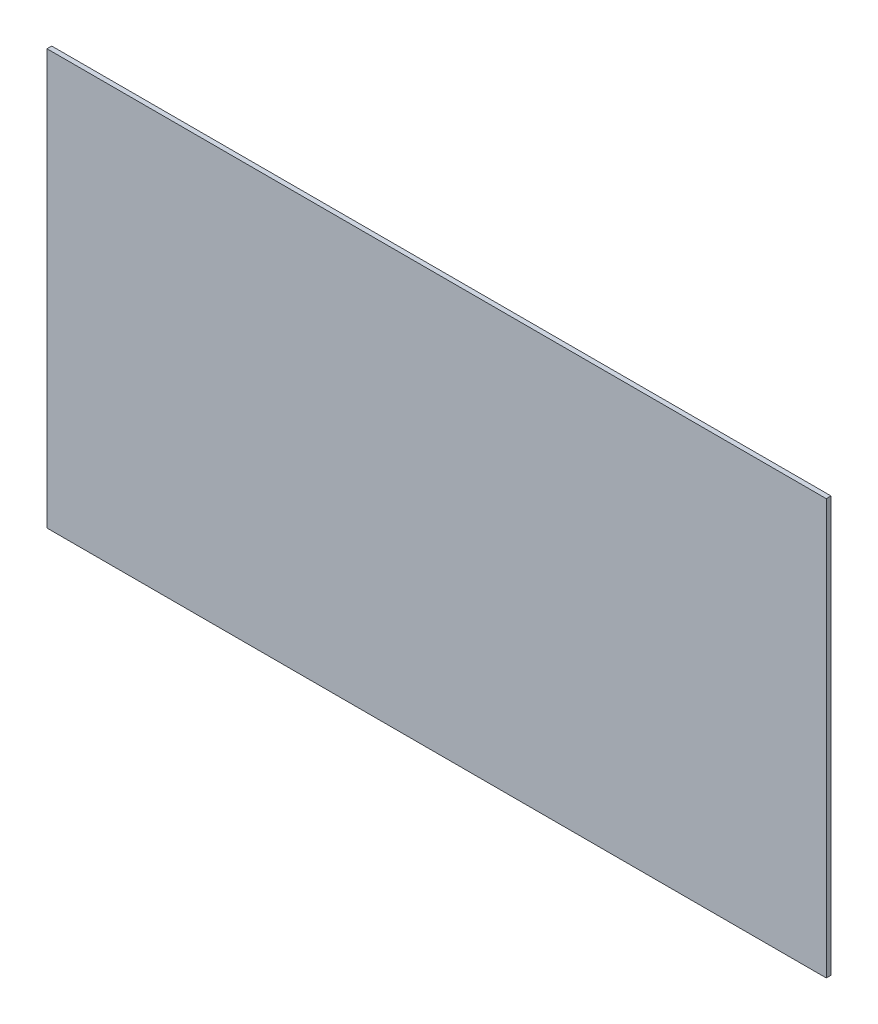
ISO-10303-21;
HEADER;
FILE_DESCRIPTION(('STEP AP214'),'2;1');
FILE_NAME('part.step','',(''),(''),'','','');
FILE_SCHEMA(('AUTOMOTIVE_DESIGN { 1 0 10303 214 1 1 1 1 }'));
ENDSEC;
DATA;
#1=APPLICATION_CONTEXT('core data for automotive mechanical design processes');
#2=APPLICATION_PROTOCOL_DEFINITION('international standard','automotive_design',2000,#1);
#3=PRODUCT_CONTEXT('',#1,'mechanical');
#4=PRODUCT('Part','Part','',(#3));
#5=PRODUCT_RELATED_PRODUCT_CATEGORY('part','',(#4));
#6=PRODUCT_DEFINITION_FORMATION('','',#4);
#7=PRODUCT_DEFINITION_CONTEXT('part definition',#1,'design');
#8=PRODUCT_DEFINITION('design','',#6,#7);
#9=PRODUCT_DEFINITION_SHAPE('','',#8);
#10=(LENGTH_UNIT() NAMED_UNIT(*) SI_UNIT(.MILLI.,.METRE.));
#11=(NAMED_UNIT(*) PLANE_ANGLE_UNIT() SI_UNIT($,.RADIAN.));
#12=(NAMED_UNIT(*) SI_UNIT($,.STERADIAN.) SOLID_ANGLE_UNIT());
#13=UNCERTAINTY_MEASURE_WITH_UNIT(LENGTH_MEASURE(1.E-05),#10,'distance_accuracy_value','');
#14=(GEOMETRIC_REPRESENTATION_CONTEXT(3) GLOBAL_UNCERTAINTY_ASSIGNED_CONTEXT((#13)) GLOBAL_UNIT_ASSIGNED_CONTEXT((#10,
#11,#12)) REPRESENTATION_CONTEXT('',''));
#15=CARTESIAN_POINT('',(0.,0.,0.));
#16=DIRECTION('',(0.,0.,1.));
#17=DIRECTION('',(1.,0.,0.));
#18=AXIS2_PLACEMENT_3D('',#15,#16,#17);
#19=CARTESIAN_POINT('',(0.,0.,3.18516));
#20=DIRECTION('',(1.,0.,0.));
#21=DIRECTION('',(0.,0.,-1.));
#22=AXIS2_PLACEMENT_3D('',#19,#20,#21);
#23=PLANE('',#22);
#24=DIRECTION('',(0.,-1.,0.));
#25=VECTOR('',#24,1.);
#26=CARTESIAN_POINT('',(0.,0.,0.));
#27=LINE('',#26,#25);
#28=CARTESIAN_POINT('',(0.,279.4,0.));
#29=VERTEX_POINT('',#28);
#30=CARTESIAN_POINT('',(0.,0.,0.));
#31=VERTEX_POINT('',#30);
#32=EDGE_CURVE('E98',#29,#31,#27,.T.);
#33=ORIENTED_EDGE('',*,*,#32,.T.);
#34=DIRECTION('',(0.,0.,-1.));
#35=VECTOR('',#34,1.);
#36=CARTESIAN_POINT('',(0.,0.,3.18516));
#37=LINE('',#36,#35);
#38=CARTESIAN_POINT('',(0.,0.,3.18516));
#39=VERTEX_POINT('',#38);
#40=EDGE_CURVE('E11',#39,#31,#37,.T.);
#41=ORIENTED_EDGE('',*,*,#40,.F.);
#42=DIRECTION('',(0.,-1.,0.));
#43=VECTOR('',#42,1.);
#44=CARTESIAN_POINT('',(0.,0.,3.18516));
#45=LINE('',#44,#43);
#46=CARTESIAN_POINT('',(0.,279.4,3.18516));
#47=VERTEX_POINT('',#46);
#48=EDGE_CURVE('E86',#47,#39,#45,.T.);
#49=ORIENTED_EDGE('',*,*,#48,.F.);
#50=DIRECTION('',(0.,0.,-1.));
#51=VECTOR('',#50,1.);
#52=CARTESIAN_POINT('',(0.,279.4,3.18516));
#53=LINE('',#52,#51);
#54=EDGE_CURVE('E94',#47,#29,#53,.T.);
#55=ORIENTED_EDGE('',*,*,#54,.T.);
#56=EDGE_LOOP('',(#33,#41,#49,#55));
#57=FACE_BOUND('',#56,.T.);
#58=ADVANCED_FACE('F35',(#57),#23,.F.);
#59=CARTESIAN_POINT('',(0.,0.,3.18516));
#60=DIRECTION('',(0.,1.,0.));
#61=DIRECTION('',(0.,0.,1.));
#62=AXIS2_PLACEMENT_3D('',#59,#60,#61);
#63=PLANE('',#62);
#64=DIRECTION('',(1.,0.,0.));
#65=VECTOR('',#64,1.);
#66=CARTESIAN_POINT('',(0.,0.,0.));
#67=LINE('',#66,#65);
#68=CARTESIAN_POINT('',(524.51,0.,0.));
#69=VERTEX_POINT('',#68);
#70=EDGE_CURVE('E90',#31,#69,#67,.T.);
#71=ORIENTED_EDGE('',*,*,#70,.T.);
#72=DIRECTION('',(0.,0.,-1.));
#73=VECTOR('',#72,1.);
#74=CARTESIAN_POINT('',(524.51,0.,3.18516));
#75=LINE('',#74,#73);
#76=CARTESIAN_POINT('',(524.51,0.,3.18516));
#77=VERTEX_POINT('',#76);
#78=EDGE_CURVE('E43',#77,#69,#75,.T.);
#79=ORIENTED_EDGE('',*,*,#78,.F.);
#80=DIRECTION('',(1.,0.,0.));
#81=VECTOR('',#80,1.);
#82=CARTESIAN_POINT('',(0.,0.,3.18516));
#83=LINE('',#82,#81);
#84=EDGE_CURVE('E81',#39,#77,#83,.T.);
#85=ORIENTED_EDGE('',*,*,#84,.F.);
#86=ORIENTED_EDGE('',*,*,#40,.T.);
#87=EDGE_LOOP('',(#71,#79,#85,#86));
#88=FACE_BOUND('',#87,.T.);
#89=ADVANCED_FACE('F89',(#88),#63,.F.);
#90=CARTESIAN_POINT('',(524.51,0.,3.18516));
#91=DIRECTION('',(-1.,0.,0.));
#92=DIRECTION('',(0.,0.,1.));
#93=AXIS2_PLACEMENT_3D('',#90,#91,#92);
#94=PLANE('',#93);
#95=DIRECTION('',(0.,1.,0.));
#96=VECTOR('',#95,1.);
#97=CARTESIAN_POINT('',(524.51,0.,0.));
#98=LINE('',#97,#96);
#99=CARTESIAN_POINT('',(524.51,279.4,0.));
#100=VERTEX_POINT('',#99);
#101=EDGE_CURVE('E68',#69,#100,#98,.T.);
#102=ORIENTED_EDGE('',*,*,#101,.T.);
#103=DIRECTION('',(0.,0.,-1.));
#104=VECTOR('',#103,1.);
#105=CARTESIAN_POINT('',(524.51,279.4,3.18516));
#106=LINE('',#105,#104);
#107=CARTESIAN_POINT('',(524.51,279.4,3.18516));
#108=VERTEX_POINT('',#107);
#109=EDGE_CURVE('E91',#108,#100,#106,.T.);
#110=ORIENTED_EDGE('',*,*,#109,.F.);
#111=DIRECTION('',(0.,1.,0.));
#112=VECTOR('',#111,1.);
#113=CARTESIAN_POINT('',(524.51,0.,3.18516));
#114=LINE('',#113,#112);
#115=EDGE_CURVE('E84',#77,#108,#114,.T.);
#116=ORIENTED_EDGE('',*,*,#115,.F.);
#117=ORIENTED_EDGE('',*,*,#78,.T.);
#118=EDGE_LOOP('',(#102,#110,#116,#117));
#119=FACE_BOUND('',#118,.T.);
#120=ADVANCED_FACE('F92',(#119),#94,.F.);
#121=CARTESIAN_POINT('',(0.,279.4,3.18516));
#122=DIRECTION('',(0.,-1.,0.));
#123=DIRECTION('',(0.,0.,-1.));
#124=AXIS2_PLACEMENT_3D('',#121,#122,#123);
#125=PLANE('',#124);
#126=DIRECTION('',(-1.,0.,0.));
#127=VECTOR('',#126,1.);
#128=CARTESIAN_POINT('',(0.,279.4,0.));
#129=LINE('',#128,#127);
#130=EDGE_CURVE('E74',#100,#29,#129,.T.);
#131=ORIENTED_EDGE('',*,*,#130,.T.);
#132=ORIENTED_EDGE('',*,*,#54,.F.);
#133=DIRECTION('',(-1.,0.,0.));
#134=VECTOR('',#133,1.);
#135=CARTESIAN_POINT('',(0.,279.4,3.18516));
#136=LINE('',#135,#134);
#137=EDGE_CURVE('E51',#108,#47,#136,.T.);
#138=ORIENTED_EDGE('',*,*,#137,.F.);
#139=ORIENTED_EDGE('',*,*,#109,.T.);
#140=EDGE_LOOP('',(#131,#132,#138,#139));
#141=FACE_BOUND('',#140,.T.);
#142=ADVANCED_FACE('F105',(#141),#125,.F.);
#143=CARTESIAN_POINT('',(0.,0.,3.18516));
#144=DIRECTION('',(0.,0.,-1.));
#145=DIRECTION('',(-1.,0.,0.));
#146=AXIS2_PLACEMENT_3D('',#143,#144,#145);
#147=PLANE('',#146);
#148=ORIENTED_EDGE('',*,*,#48,.T.);
#149=ORIENTED_EDGE('',*,*,#84,.T.);
#150=ORIENTED_EDGE('',*,*,#115,.T.);
#151=ORIENTED_EDGE('',*,*,#137,.T.);
#152=EDGE_LOOP('',(#148,#149,#150,#151));
#153=FACE_BOUND('',#152,.T.);
#154=ADVANCED_FACE('F82',(#153),#147,.F.);
#155=CARTESIAN_POINT('',(0.,0.,0.));
#156=DIRECTION('',(0.,0.,-1.));
#157=DIRECTION('',(-1.,0.,0.));
#158=AXIS2_PLACEMENT_3D('',#155,#156,#157);
#159=PLANE('',#158);
#160=ORIENTED_EDGE('',*,*,#32,.F.);
#161=ORIENTED_EDGE('',*,*,#130,.F.);
#162=ORIENTED_EDGE('',*,*,#101,.F.);
#163=ORIENTED_EDGE('',*,*,#70,.F.);
#164=EDGE_LOOP('',(#160,#161,#162,#163));
#165=FACE_BOUND('',#164,.T.);
#166=ADVANCED_FACE('F108',(#165),#159,.T.);
#167=CLOSED_SHELL('',(#58,#89,#120,#142,#154,#166));
#168=MANIFOLD_SOLID_BREP('B2',#167);
#169=ADVANCED_BREP_SHAPE_REPRESENTATION('',(#18,#168),#14);
#170=SHAPE_DEFINITION_REPRESENTATION(#9,#169);
ENDSEC;
END-ISO-10303-21;
